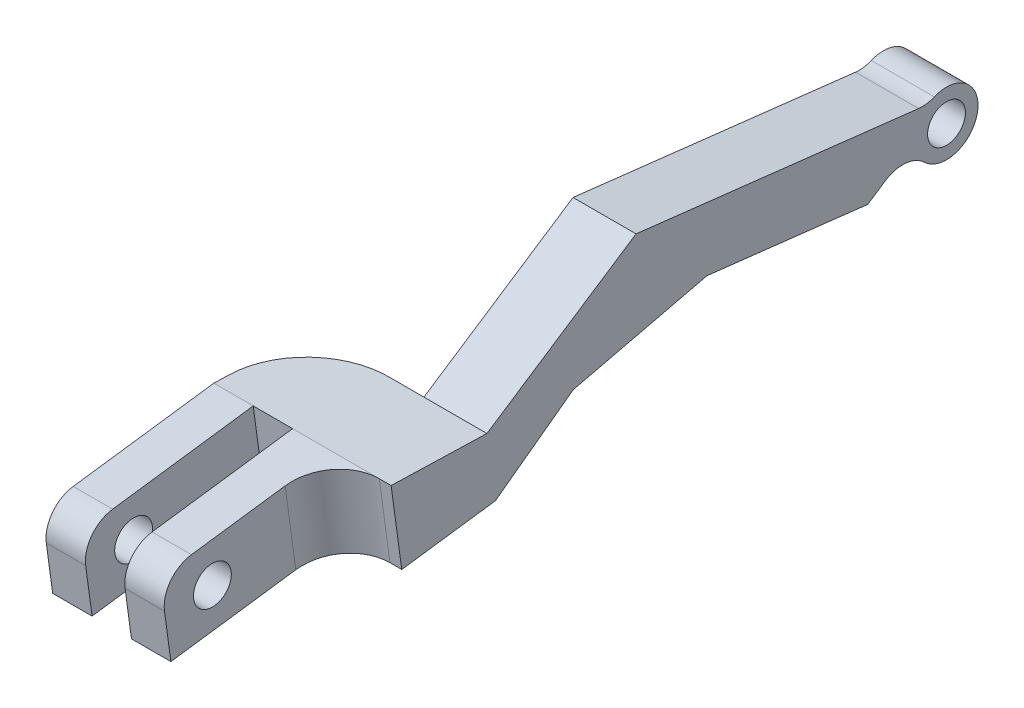
ISO-10303-21;
HEADER;
FILE_DESCRIPTION(('STEP AP214'),'2;1');
FILE_NAME('part.step','',(''),(''),'','','');
FILE_SCHEMA(('AUTOMOTIVE_DESIGN { 1 0 10303 214 1 1 1 1 }'));
ENDSEC;
DATA;
#1=APPLICATION_CONTEXT('core data for automotive mechanical design processes');
#2=APPLICATION_PROTOCOL_DEFINITION('international standard','automotive_design',2000,#1);
#3=PRODUCT_CONTEXT('',#1,'mechanical');
#4=PRODUCT('Part','Part','',(#3));
#5=PRODUCT_RELATED_PRODUCT_CATEGORY('part','',(#4));
#6=PRODUCT_DEFINITION_FORMATION('','',#4);
#7=PRODUCT_DEFINITION_CONTEXT('part definition',#1,'design');
#8=PRODUCT_DEFINITION('design','',#6,#7);
#9=PRODUCT_DEFINITION_SHAPE('','',#8);
#10=(LENGTH_UNIT() NAMED_UNIT(*) SI_UNIT(.MILLI.,.METRE.));
#11=(NAMED_UNIT(*) PLANE_ANGLE_UNIT() SI_UNIT($,.RADIAN.));
#12=(NAMED_UNIT(*) SI_UNIT($,.STERADIAN.) SOLID_ANGLE_UNIT());
#13=UNCERTAINTY_MEASURE_WITH_UNIT(LENGTH_MEASURE(1.E-05),#10,'distance_accuracy_value','');
#14=(GEOMETRIC_REPRESENTATION_CONTEXT(3) GLOBAL_UNCERTAINTY_ASSIGNED_CONTEXT((#13)) GLOBAL_UNIT_ASSIGNED_CONTEXT((#10,
#11,#12)) REPRESENTATION_CONTEXT('',''));
#15=CARTESIAN_POINT('',(0.,0.,0.));
#16=DIRECTION('',(0.,0.,1.));
#17=DIRECTION('',(1.,0.,0.));
#18=AXIS2_PLACEMENT_3D('',#15,#16,#17);
#19=CARTESIAN_POINT('',(-2.,0.,0.));
#20=DIRECTION('',(1.,0.,0.));
#21=DIRECTION('',(0.,0.,-1.));
#22=AXIS2_PLACEMENT_3D('',#19,#20,#21);
#23=PLANE('',#22);
#24=CARTESIAN_POINT('',(-2.,-2.82842712474619,-2.82842712474619));
#25=DIRECTION('',(1.,0.,0.));
#26=DIRECTION('',(0.,0.,-1.));
#27=AXIS2_PLACEMENT_3D('',#24,#25,#26);
#28=CIRCLE('',#27,1.2);
#29=CARTESIAN_POINT('',(-2.,-2.82842712474619,-4.02842712474618));
#30=VERTEX_POINT('',#29);
#31=EDGE_CURVE('E338',#30,#30,#28,.T.);
#32=ORIENTED_EDGE('',*,*,#31,.T.);
#33=EDGE_LOOP('',(#32));
#34=FACE_BOUND('',#33,.T.);
#35=DIRECTION('',(0.,-0.990856207200545,-0.134922113280779));
#36=VECTOR('',#35,1.);
#37=CARTESIAN_POINT('',(-2.,-3.6162780136907,26.5576296553513));
#38=LINE('',#37,#36);
#39=CARTESIAN_POINT('',(-2.,-5.28506014111271,26.3303962691135));
#40=VERTEX_POINT('',#39);
#41=CARTESIAN_POINT('',(-2.,-9.24848496991488,25.7907078159904));
#42=VERTEX_POINT('',#41);
#43=EDGE_CURVE('E273',#40,#42,#38,.T.);
#44=ORIENTED_EDGE('',*,*,#43,.F.);
#45=DIRECTION('',(0.,-0.550374531244968,0.834917885397649));
#46=VECTOR('',#45,1.);
#47=CARTESIAN_POINT('',(-2.,8.41512757073982,5.54721844281332));
#48=LINE('',#47,#46);
#49=CARTESIAN_POINT('',(-2.,0.952983865511061,16.8672866676453));
#50=VERTEX_POINT('',#49);
#51=EDGE_CURVE('E323',#50,#40,#48,.T.);
#52=ORIENTED_EDGE('',*,*,#51,.F.);
#53=DIRECTION('',(0.,0.115063520544876,0.993358135940819));
#54=VECTOR('',#53,1.);
#55=CARTESIAN_POINT('',(-2.,-0.987552066700198,0.114390986900482));
#56=LINE('',#55,#54);
#57=CARTESIAN_POINT('',(-2.,-1.12340755019662,-1.0584668328871));
#58=VERTEX_POINT('',#57);
#59=EDGE_CURVE('E320',#58,#50,#56,.T.);
#60=ORIENTED_EDGE('',*,*,#59,.F.);
#61=CARTESIAN_POINT('',(-2.,0.863308721685015,-1.28859387397686));
#62=DIRECTION('',(1.,0.,0.));
#63=DIRECTION('',(0.,0.,-1.));
#64=AXIS2_PLACEMENT_3D('',#61,#62,#63);
#65=CIRCLE('',#64,2.);
#66=CARTESIAN_POINT('',(-2.,-0.98255920153059,-2.05851049936152));
#67=VERTEX_POINT('',#66);
#68=EDGE_CURVE('E318',#58,#67,#65,.T.);
#69=ORIENTED_EDGE('',*,*,#68,.T.);
#70=CARTESIAN_POINT('',(-2.,-2.82842712474619,-2.82842712474619));
#71=DIRECTION('',(1.,0.,0.));
#72=DIRECTION('',(0.,0.,-1.));
#73=AXIS2_PLACEMENT_3D('',#70,#71,#72);
#74=CIRCLE('',#73,2.);
#75=CARTESIAN_POINT('',(-2.,-4.26750807201749,-1.43952611056239));
#76=VERTEX_POINT('',#75);
#77=EDGE_CURVE('E335',#76,#67,#74,.T.);
#78=ORIENTED_EDGE('',*,*,#77,.F.);
#79=CARTESIAN_POINT('',(-2.,-5.70658901928878,-0.050625096378604));
#80=DIRECTION('',(1.,0.,0.));
#81=DIRECTION('',(0.,0.,-1.));
#82=AXIS2_PLACEMENT_3D('',#79,#80,#81);
#83=CIRCLE('',#82,2.);
#84=CARTESIAN_POINT('',(-2.,-4.03675324849347,1.05012396611132));
#85=VERTEX_POINT('',#84);
#86=EDGE_CURVE('E333',#76,#85,#83,.T.);
#87=ORIENTED_EDGE('',*,*,#86,.T.);
#88=DIRECTION('',(0.,0.550374531244962,-0.834917885397653));
#89=VECTOR('',#88,1.);
#90=CARTESIAN_POINT('',(-2.,-2.33142136393588,-1.53686363982916));
#91=LINE('',#90,#89);
#92=CARTESIAN_POINT('',(-2.,-4.77600788476289,2.17157287525382));
#93=VERTEX_POINT('',#92);
#94=EDGE_CURVE('E330',#93,#85,#91,.T.);
#95=ORIENTED_EDGE('',*,*,#94,.F.);
#96=DIRECTION('',(0.,0.115063520544876,0.993358135940819));
#97=VECTOR('',#96,1.);
#98=CARTESIAN_POINT('',(-2.,-4.96098461046348,0.574645069079988));
#99=LINE('',#98,#97);
#100=CARTESIAN_POINT('',(-2.,-3.59576628097659,12.3607500701208));
#101=VERTEX_POINT('',#100);
#102=EDGE_CURVE('E328',#93,#101,#99,.T.);
#103=ORIENTED_EDGE('',*,*,#102,.T.);
#104=DIRECTION('',(0.,0.231624150850534,-0.972805351929547));
#105=VECTOR('',#104,1.);
#106=CARTESIAN_POINT('',(-2.,-0.617665679203451,-0.147065688085749));
#107=LINE('',#106,#105);
#108=CARTESIAN_POINT('',(-2.,-5.61916698864486,20.8588925578094));
#109=VERTEX_POINT('',#108);
#110=EDGE_CURVE('E11',#101,#109,#107,.F.);
#111=ORIENTED_EDGE('',*,*,#110,.T.);
#112=DIRECTION('',(0.,-0.592706629550145,0.805418432423363));
#113=VECTOR('',#112,1.);
#114=CARTESIAN_POINT('',(-2.,6.31240513743532,4.64529271090441));
#115=LINE('',#114,#113);
#116=EDGE_CURVE('E326',#109,#42,#115,.T.);
#117=ORIENTED_EDGE('',*,*,#116,.T.);
#118=EDGE_LOOP('',(#44,#52,#60,#69,#78,#87,#95,#103,#111,#117));
#119=FACE_BOUND('',#118,.T.);
#120=ADVANCED_FACE('F38',(#34,#119),#23,.F.);
#121=CARTESIAN_POINT('',(-2.,0.863308721685015,-1.28859387397686));
#122=DIRECTION('',(1.,0.,0.));
#123=DIRECTION('',(0.,0.,-1.));
#124=AXIS2_PLACEMENT_3D('',#121,#122,#123);
#125=CYLINDRICAL_SURFACE('',#124,2.);
#126=DIRECTION('',(1.,0.,0.));
#127=VECTOR('',#126,1.);
#128=CARTESIAN_POINT('',(-2.,-1.12340755019662,-1.0584668328871));
#129=LINE('',#128,#127);
#130=CARTESIAN_POINT('',(2.,-1.12340755019662,-1.0584668328871));
#131=VERTEX_POINT('',#130);
#132=EDGE_CURVE('E341',#58,#131,#129,.T.);
#133=ORIENTED_EDGE('',*,*,#132,.T.);
#134=CARTESIAN_POINT('',(2.,0.863308721685015,-1.28859387397686));
#135=DIRECTION('',(1.,0.,0.));
#136=DIRECTION('',(0.,0.,-1.));
#137=AXIS2_PLACEMENT_3D('',#134,#135,#136);
#138=CIRCLE('',#137,2.);
#139=CARTESIAN_POINT('',(2.,-0.98255920153059,-2.05851049936152));
#140=VERTEX_POINT('',#139);
#141=EDGE_CURVE('E284',#131,#140,#138,.T.);
#142=ORIENTED_EDGE('',*,*,#141,.T.);
#143=DIRECTION('',(1.,0.,0.));
#144=VECTOR('',#143,1.);
#145=CARTESIAN_POINT('',(-2.,-0.98255920153059,-2.05851049936152));
#146=LINE('',#145,#144);
#147=EDGE_CURVE('E342',#67,#140,#146,.T.);
#148=ORIENTED_EDGE('',*,*,#147,.F.);
#149=ORIENTED_EDGE('',*,*,#68,.F.);
#150=EDGE_LOOP('',(#133,#142,#148,#149));
#151=FACE_BOUND('',#150,.T.);
#152=ADVANCED_FACE('F438',(#151),#125,.F.);
#153=CARTESIAN_POINT('',(-2.,-2.82842712474619,-2.82842712474619));
#154=DIRECTION('',(1.,0.,0.));
#155=DIRECTION('',(0.,0.,-1.));
#156=AXIS2_PLACEMENT_3D('',#153,#154,#155);
#157=CYLINDRICAL_SURFACE('',#156,2.);
#158=ORIENTED_EDGE('',*,*,#147,.T.);
#159=CARTESIAN_POINT('',(2.,-2.82842712474619,-2.82842712474619));
#160=DIRECTION('',(1.,0.,0.));
#161=DIRECTION('',(0.,0.,-1.));
#162=AXIS2_PLACEMENT_3D('',#159,#160,#161);
#163=CIRCLE('',#162,2.);
#164=CARTESIAN_POINT('',(2.,-4.26750807201749,-1.43952611056239));
#165=VERTEX_POINT('',#164);
#166=EDGE_CURVE('E312',#165,#140,#163,.T.);
#167=ORIENTED_EDGE('',*,*,#166,.F.);
#168=DIRECTION('',(1.,0.,0.));
#169=VECTOR('',#168,1.);
#170=CARTESIAN_POINT('',(-2.,-4.26750807201749,-1.43952611056239));
#171=LINE('',#170,#169);
#172=EDGE_CURVE('E345',#76,#165,#171,.T.);
#173=ORIENTED_EDGE('',*,*,#172,.F.);
#174=ORIENTED_EDGE('',*,*,#77,.T.);
#175=EDGE_LOOP('',(#158,#167,#173,#174));
#176=FACE_BOUND('',#175,.T.);
#177=ADVANCED_FACE('F445',(#176),#157,.T.);
#178=CARTESIAN_POINT('',(-2.,-5.70658901928878,-0.050625096378604));
#179=DIRECTION('',(1.,0.,0.));
#180=DIRECTION('',(0.,0.,-1.));
#181=AXIS2_PLACEMENT_3D('',#178,#179,#180);
#182=CYLINDRICAL_SURFACE('',#181,2.);
#183=ORIENTED_EDGE('',*,*,#172,.T.);
#184=CARTESIAN_POINT('',(2.,-5.70658901928878,-0.050625096378604));
#185=DIRECTION('',(1.,0.,0.));
#186=DIRECTION('',(0.,0.,-1.));
#187=AXIS2_PLACEMENT_3D('',#184,#185,#186);
#188=CIRCLE('',#187,2.);
#189=CARTESIAN_POINT('',(2.,-4.03675324849347,1.05012396611132));
#190=VERTEX_POINT('',#189);
#191=EDGE_CURVE('E309',#165,#190,#188,.T.);
#192=ORIENTED_EDGE('',*,*,#191,.T.);
#193=DIRECTION('',(1.,0.,0.));
#194=VECTOR('',#193,1.);
#195=CARTESIAN_POINT('',(-2.,-4.03675324849347,1.05012396611132));
#196=LINE('',#195,#194);
#197=EDGE_CURVE('E347',#85,#190,#196,.T.);
#198=ORIENTED_EDGE('',*,*,#197,.F.);
#199=ORIENTED_EDGE('',*,*,#86,.F.);
#200=EDGE_LOOP('',(#183,#192,#198,#199));
#201=FACE_BOUND('',#200,.T.);
#202=ADVANCED_FACE('F447',(#201),#182,.F.);
#203=CARTESIAN_POINT('',(-2.,-2.33142136393588,-1.53686363982916));
#204=DIRECTION('',(0.,-0.834917885397653,-0.550374531244962));
#205=DIRECTION('',(0.,0.550374531244962,-0.834917885397653));
#206=AXIS2_PLACEMENT_3D('',#203,#204,#205);
#207=PLANE('',#206);
#208=ORIENTED_EDGE('',*,*,#197,.T.);
#209=DIRECTION('',(0.,0.550374531244962,-0.834917885397653));
#210=VECTOR('',#209,1.);
#211=CARTESIAN_POINT('',(2.,-2.33142136393588,-1.53686363982916));
#212=LINE('',#211,#210);
#213=CARTESIAN_POINT('',(2.,-4.77600788476289,2.17157287525382));
#214=VERTEX_POINT('',#213);
#215=EDGE_CURVE('E306',#214,#190,#212,.T.);
#216=ORIENTED_EDGE('',*,*,#215,.F.);
#217=DIRECTION('',(1.,0.,0.));
#218=VECTOR('',#217,1.);
#219=CARTESIAN_POINT('',(-2.,-4.77600788476289,2.17157287525382));
#220=LINE('',#219,#218);
#221=EDGE_CURVE('E349',#93,#214,#220,.T.);
#222=ORIENTED_EDGE('',*,*,#221,.F.);
#223=ORIENTED_EDGE('',*,*,#94,.T.);
#224=EDGE_LOOP('',(#208,#216,#222,#223));
#225=FACE_BOUND('',#224,.T.);
#226=ADVANCED_FACE('F450',(#225),#207,.T.);
#227=CARTESIAN_POINT('',(-2.,-4.96098461046348,0.574645069079988));
#228=DIRECTION('',(0.,0.993358135940819,-0.115063520544876));
#229=DIRECTION('',(0.,0.115063520544876,0.993358135940819));
#230=AXIS2_PLACEMENT_3D('',#227,#228,#229);
#231=PLANE('',#230);
#232=DIRECTION('',(0.,0.115063520544876,0.993358135940819));
#233=VECTOR('',#232,1.);
#234=CARTESIAN_POINT('',(2.,-4.96098461046348,0.574645069079988));
#235=LINE('',#234,#233);
#236=CARTESIAN_POINT('',(2.,-3.59576628097659,12.3607500701208));
#237=VERTEX_POINT('',#236);
#238=EDGE_CURVE('E304',#214,#237,#235,.T.);
#239=ORIENTED_EDGE('',*,*,#238,.T.);
#240=DIRECTION('',(-1.,0.,0.));
#241=VECTOR('',#240,1.);
#242=CARTESIAN_POINT('',(-2.,-3.59576628097659,12.3607500701208));
#243=LINE('',#242,#241);
#244=EDGE_CURVE('E54',#237,#101,#243,.T.);
#245=ORIENTED_EDGE('',*,*,#244,.T.);
#246=ORIENTED_EDGE('',*,*,#102,.F.);
#247=ORIENTED_EDGE('',*,*,#221,.T.);
#248=EDGE_LOOP('',(#239,#245,#246,#247));
#249=FACE_BOUND('',#248,.T.);
#250=ADVANCED_FACE('F478',(#249),#231,.F.);
#251=CARTESIAN_POINT('',(-2.,6.31240513743532,4.64529271090441));
#252=DIRECTION('',(0.,0.805418432423363,0.592706629550145));
#253=DIRECTION('',(0.,-0.592706629550145,0.805418432423363));
#254=AXIS2_PLACEMENT_3D('',#251,#252,#253);
#255=PLANE('',#254);
#256=ORIENTED_EDGE('',*,*,#116,.F.);
#257=DIRECTION('',(1.,0.,0.));
#258=VECTOR('',#257,1.);
#259=CARTESIAN_POINT('',(2.,-5.61916698864485,20.8588925578094));
#260=LINE('',#259,#258);
#261=CARTESIAN_POINT('',(2.,-5.61916698864486,20.8588925578094));
#262=VERTEX_POINT('',#261);
#263=EDGE_CURVE('E397',#109,#262,#260,.T.);
#264=ORIENTED_EDGE('',*,*,#263,.T.);
#265=DIRECTION('',(0.,-0.592706629550145,0.805418432423363));
#266=VECTOR('',#265,1.);
#267=CARTESIAN_POINT('',(2.,6.31240513743532,4.64529271090441));
#268=LINE('',#267,#266);
#269=CARTESIAN_POINT('',(2.,-9.24848496991488,25.7907078159904));
#270=VERTEX_POINT('',#269);
#271=EDGE_CURVE('E302',#262,#270,#268,.T.);
#272=ORIENTED_EDGE('',*,*,#271,.T.);
#273=DIRECTION('',(1.,0.,0.));
#274=VECTOR('',#273,1.);
#275=CARTESIAN_POINT('',(-2.,-9.24848496991488,25.7907078159904));
#276=LINE('',#275,#274);
#277=EDGE_CURVE('E351',#42,#270,#276,.T.);
#278=ORIENTED_EDGE('',*,*,#277,.F.);
#279=EDGE_LOOP('',(#256,#264,#272,#278));
#280=FACE_BOUND('',#279,.T.);
#281=ADVANCED_FACE('F403',(#280),#255,.F.);
#282=CARTESIAN_POINT('',(-2.,-5.63220695622419,-0.766921839360962));
#283=DIRECTION('',(0.,0.990856207200545,0.134922113280778));
#284=DIRECTION('',(0.,-0.134922113280778,0.990856207200545));
#285=AXIS2_PLACEMENT_3D('',#282,#283,#284);
#286=PLANE('',#285);
#287=DIRECTION('',(0.,0.134922113280778,-0.990856207200545));
#288=VECTOR('',#287,1.);
#289=CARTESIAN_POINT('',(-9.25,-5.6322069562242,-0.766921839360962));
#290=LINE('',#289,#288);
#291=CARTESIAN_POINT('',(-9.25,-11.5421608956881,42.6352633383996));
#292=VERTEX_POINT('',#291);
#293=CARTESIAN_POINT('',(-9.25,-9.92309553631877,30.7449888519931));
#294=VERTEX_POINT('',#293);
#295=EDGE_CURVE('E209',#292,#294,#290,.T.);
#296=ORIENTED_EDGE('',*,*,#295,.T.);
#297=CARTESIAN_POINT('',(-4.25,-9.92309553631877,30.7449888519931));
#298=DIRECTION('',(0.,0.990856207200545,0.134922113280778));
#299=DIRECTION('',(0.,-0.134922113280778,0.990856207200545));
#300=AXIS2_PLACEMENT_3D('',#297,#298,#299);
#301=CIRCLE('',#300,5.);
#302=CARTESIAN_POINT('',(-4.25,-9.24848496991488,25.7907078159904));
#303=VERTEX_POINT('',#302);
#304=EDGE_CURVE('E391',#294,#303,#301,.F.);
#305=ORIENTED_EDGE('',*,*,#304,.T.);
#306=DIRECTION('',(1.,0.,0.));
#307=VECTOR('',#306,1.);
#308=CARTESIAN_POINT('',(-4.25,-9.24848496991488,25.7907078159904));
#309=LINE('',#308,#307);
#310=EDGE_CURVE('E277',#303,#42,#309,.T.);
#311=ORIENTED_EDGE('',*,*,#310,.T.);
#312=ORIENTED_EDGE('',*,*,#277,.T.);
#313=DIRECTION('',(0.,-0.134922113280778,0.990856207200545));
#314=VECTOR('',#313,1.);
#315=CARTESIAN_POINT('',(2.,-5.63220695622419,-0.766921839360962));
#316=LINE('',#315,#314);
#317=CARTESIAN_POINT('',(2.,-10.0580176495996,31.7358450591936));
#318=VERTEX_POINT('',#317);
#319=EDGE_CURVE('E299',#270,#318,#316,.T.);
#320=ORIENTED_EDGE('',*,*,#319,.T.);
#321=DIRECTION('',(1.,0.,0.));
#322=VECTOR('',#321,1.);
#323=CARTESIAN_POINT('',(-2.,-10.0580176495996,31.7358450591936));
#324=LINE('',#323,#322);
#325=CARTESIAN_POINT('',(1.25,-10.0580176495996,31.7358450591936));
#326=VERTEX_POINT('',#325);
#327=EDGE_CURVE('E354',#326,#318,#324,.T.);
#328=ORIENTED_EDGE('',*,*,#327,.F.);
#329=CARTESIAN_POINT('',(1.25,-10.4627839894419,34.7084136807953));
#330=DIRECTION('',(0.,0.990856207200545,0.134922113280778));
#331=DIRECTION('',(0.,-0.134922113280778,0.990856207200545));
#332=AXIS2_PLACEMENT_3D('',#329,#330,#331);
#333=CIRCLE('',#332,3.);
#334=CARTESIAN_POINT('',(-1.75,-10.4627839894419,34.7084136807953));
#335=VERTEX_POINT('',#334);
#336=EDGE_CURVE('E371',#326,#335,#333,.T.);
#337=ORIENTED_EDGE('',*,*,#336,.T.);
#338=DIRECTION('',(0.,-0.134922113280778,0.990856207200545));
#339=VECTOR('',#338,1.);
#340=CARTESIAN_POINT('',(-1.75,-5.63220695622419,-0.766921839360962));
#341=LINE('',#340,#339);
#342=CARTESIAN_POINT('',(-1.75,-11.5421608956881,42.6352633383996));
#343=VERTEX_POINT('',#342);
#344=EDGE_CURVE('E258',#335,#343,#341,.T.);
#345=ORIENTED_EDGE('',*,*,#344,.T.);
#346=DIRECTION('',(-1.,0.,0.));
#347=VECTOR('',#346,1.);
#348=CARTESIAN_POINT('',(-1.75,-11.5421608956881,42.6352633383996));
#349=LINE('',#348,#347);
#350=CARTESIAN_POINT('',(-4.25,-11.5421608956881,42.6352633383996));
#351=VERTEX_POINT('',#350);
#352=EDGE_CURVE('E267',#343,#351,#349,.T.);
#353=ORIENTED_EDGE('',*,*,#352,.T.);
#354=DIRECTION('',(0.,-0.134922113280778,0.990856207200545));
#355=VECTOR('',#354,1.);
#356=CARTESIAN_POINT('',(-4.25,-5.63220695622419,-0.766921839360962));
#357=LINE('',#356,#355);
#358=CARTESIAN_POINT('',(-4.25,-10.0580176495995,31.7358450591936));
#359=VERTEX_POINT('',#358);
#360=EDGE_CURVE('E274',#359,#351,#357,.T.);
#361=ORIENTED_EDGE('',*,*,#360,.F.);
#362=DIRECTION('',(1.,0.,0.));
#363=VECTOR('',#362,1.);
#364=CARTESIAN_POINT('',(-6.75,-10.0580176495995,31.7358450591936));
#365=LINE('',#364,#363);
#366=CARTESIAN_POINT('',(-6.75,-10.0580176495995,31.7358450591936));
#367=VERTEX_POINT('',#366);
#368=EDGE_CURVE('E249',#367,#359,#365,.T.);
#369=ORIENTED_EDGE('',*,*,#368,.F.);
#370=DIRECTION('',(0.,0.134922113280778,-0.990856207200545));
#371=VECTOR('',#370,1.);
#372=CARTESIAN_POINT('',(-6.75,-5.6322069562242,-0.766921839360962));
#373=LINE('',#372,#371);
#374=CARTESIAN_POINT('',(-6.75,-11.5421608956881,42.6352633383996));
#375=VERTEX_POINT('',#374);
#376=EDGE_CURVE('E215',#375,#367,#373,.T.);
#377=ORIENTED_EDGE('',*,*,#376,.F.);
#378=DIRECTION('',(1.,0.,0.));
#379=VECTOR('',#378,1.);
#380=CARTESIAN_POINT('',(-9.25,-11.5421608956881,42.6352633383996));
#381=LINE('',#380,#379);
#382=EDGE_CURVE('E201',#292,#375,#381,.T.);
#383=ORIENTED_EDGE('',*,*,#382,.F.);
#384=EDGE_LOOP('',(#296,#305,#311,#312,#320,#328,#337,#345,#353,#361,#369,#377,#383));
#385=FACE_BOUND('',#384,.T.);
#386=ADVANCED_FACE('F213',(#385),#286,.F.);
#387=CARTESIAN_POINT('',(-2.,-4.4258106933754,32.5027668985546));
#388=DIRECTION('',(0.,-0.13492211328078,0.990856207200544));
#389=DIRECTION('',(0.,-0.990856207200545,-0.13492211328078));
#390=AXIS2_PLACEMENT_3D('',#387,#388,#389);
#391=PLANE('',#390);
#392=DIRECTION('',(1.,0.,0.));
#393=VECTOR('',#392,1.);
#394=CARTESIAN_POINT('',(-2.,-5.10373661359682,32.4104556255975));
#395=LINE('',#394,#393);
#396=CARTESIAN_POINT('',(1.25,-5.10373661359682,32.4104556255975));
#397=VERTEX_POINT('',#396);
#398=CARTESIAN_POINT('',(2.,-5.10373661359682,32.4104556255975));
#399=VERTEX_POINT('',#398);
#400=EDGE_CURVE('E358',#397,#399,#395,.T.);
#401=ORIENTED_EDGE('',*,*,#400,.F.);
#402=DIRECTION('',(0.,0.990856207200545,0.13492211328078));
#403=VECTOR('',#402,1.);
#404=CARTESIAN_POINT('',(1.25,-10.0580176495996,31.7358450591936));
#405=LINE('',#404,#403);
#406=EDGE_CURVE('E366',#397,#326,#405,.F.);
#407=ORIENTED_EDGE('',*,*,#406,.T.);
#408=ORIENTED_EDGE('',*,*,#327,.T.);
#409=DIRECTION('',(0.,-0.990856207200545,-0.13492211328078));
#410=VECTOR('',#409,1.);
#411=CARTESIAN_POINT('',(2.,-4.4258106933754,32.5027668985546));
#412=LINE('',#411,#410);
#413=EDGE_CURVE('E296',#399,#318,#412,.T.);
#414=ORIENTED_EDGE('',*,*,#413,.F.);
#415=EDGE_LOOP('',(#401,#407,#408,#414));
#416=FACE_BOUND('',#415,.T.);
#417=ADVANCED_FACE('F485',(#416),#391,.T.);
#418=CARTESIAN_POINT('',(-2.,-6.06490845541675,0.180871687383165));
#419=DIRECTION('',(0.,-0.99955560096244,0.0298094042982462));
#420=DIRECTION('',(0.,-0.0298094042982462,-0.99955560096244));
#421=AXIS2_PLACEMENT_3D('',#418,#419,#420);
#422=PLANE('',#421);
#423=DIRECTION('',(1.,0.,0.));
#424=VECTOR('',#423,1.);
#425=CARTESIAN_POINT('',(-4.25,-5.2850601411127,26.3303962691135));
#426=LINE('',#425,#424);
#427=CARTESIAN_POINT('',(-4.25,-5.2850601411127,26.3303962691135));
#428=VERTEX_POINT('',#427);
#429=EDGE_CURVE('E282',#428,#40,#426,.T.);
#430=ORIENTED_EDGE('',*,*,#429,.F.);
#431=CARTESIAN_POINT('',(-4.25,-5.13395720151614,31.3971123995169));
#432=DIRECTION('',(0.,-0.99955560096244,0.0298094042982462));
#433=DIRECTION('',(0.,-0.0298094042982462,-0.99955560096244));
#434=AXIS2_PLACEMENT_3D('',#431,#432,#433);
#435=ELLIPSE('',#434,5.06896877524852,5.);
#436=CARTESIAN_POINT('',(-9.25,-5.13395720151613,31.3971123995169));
#437=VERTEX_POINT('',#436);
#438=EDGE_CURVE('E395',#428,#437,#435,.F.);
#439=ORIENTED_EDGE('',*,*,#438,.T.);
#440=DIRECTION('',(0.,-0.0298094042982462,-0.99955560096244));
#441=VECTOR('',#440,1.);
#442=CARTESIAN_POINT('',(-9.25,-6.06490845541675,0.180871687383165));
#443=LINE('',#442,#441);
#444=CARTESIAN_POINT('',(-9.25,-5.10373661359682,32.4104556255976));
#445=VERTEX_POINT('',#444);
#446=EDGE_CURVE('E235',#445,#437,#443,.T.);
#447=ORIENTED_EDGE('',*,*,#446,.F.);
#448=DIRECTION('',(1.,0.,0.));
#449=VECTOR('',#448,1.);
#450=CARTESIAN_POINT('',(-9.25,-5.10373661359682,32.4104556255976));
#451=LINE('',#450,#449);
#452=CARTESIAN_POINT('',(-6.75,-5.10373661359682,32.4104556255976));
#453=VERTEX_POINT('',#452);
#454=EDGE_CURVE('E217',#445,#453,#451,.T.);
#455=ORIENTED_EDGE('',*,*,#454,.T.);
#456=DIRECTION('',(1.,0.,0.));
#457=VECTOR('',#456,1.);
#458=CARTESIAN_POINT('',(-6.75,-5.10373661359682,32.4104556255975));
#459=LINE('',#458,#457);
#460=CARTESIAN_POINT('',(-4.25,-5.10373661359682,32.4104556255975));
#461=VERTEX_POINT('',#460);
#462=EDGE_CURVE('E245',#453,#461,#459,.T.);
#463=ORIENTED_EDGE('',*,*,#462,.T.);
#464=EDGE_CURVE('E356',#461,#397,#395,.T.);
#465=ORIENTED_EDGE('',*,*,#464,.T.);
#466=ORIENTED_EDGE('',*,*,#400,.T.);
#467=DIRECTION('',(0.,-0.0298094042982462,-0.99955560096244));
#468=VECTOR('',#467,1.);
#469=CARTESIAN_POINT('',(2.,-6.06490845541675,0.180871687383165));
#470=LINE('',#469,#468);
#471=CARTESIAN_POINT('',(2.,-5.28506014111271,26.3303962691135));
#472=VERTEX_POINT('',#471);
#473=EDGE_CURVE('E293',#399,#472,#470,.T.);
#474=ORIENTED_EDGE('',*,*,#473,.T.);
#475=DIRECTION('',(1.,0.,0.));
#476=VECTOR('',#475,1.);
#477=CARTESIAN_POINT('',(-2.,-5.28506014111271,26.3303962691135));
#478=LINE('',#477,#476);
#479=EDGE_CURVE('E359',#40,#472,#478,.T.);
#480=ORIENTED_EDGE('',*,*,#479,.F.);
#481=EDGE_LOOP('',(#430,#439,#447,#455,#463,#465,#466,#474,#480));
#482=FACE_BOUND('',#481,.T.);
#483=ADVANCED_FACE('F426',(#482),#422,.F.);
#484=CARTESIAN_POINT('',(-2.,8.41512757073982,5.54721844281332));
#485=DIRECTION('',(0.,0.834917885397649,0.550374531244968));
#486=DIRECTION('',(0.,-0.550374531244968,0.834917885397649));
#487=AXIS2_PLACEMENT_3D('',#484,#485,#486);
#488=PLANE('',#487);
#489=ORIENTED_EDGE('',*,*,#479,.T.);
#490=DIRECTION('',(0.,-0.550374531244968,0.834917885397649));
#491=VECTOR('',#490,1.);
#492=CARTESIAN_POINT('',(2.,8.41512757073982,5.54721844281332));
#493=LINE('',#492,#491);
#494=CARTESIAN_POINT('',(2.,0.952983865511061,16.8672866676453));
#495=VERTEX_POINT('',#494);
#496=EDGE_CURVE('E290',#495,#472,#493,.T.);
#497=ORIENTED_EDGE('',*,*,#496,.F.);
#498=DIRECTION('',(1.,0.,0.));
#499=VECTOR('',#498,1.);
#500=CARTESIAN_POINT('',(-2.,0.952983865511061,16.8672866676453));
#501=LINE('',#500,#499);
#502=EDGE_CURVE('E361',#50,#495,#501,.T.);
#503=ORIENTED_EDGE('',*,*,#502,.F.);
#504=ORIENTED_EDGE('',*,*,#51,.T.);
#505=EDGE_LOOP('',(#489,#497,#503,#504));
#506=FACE_BOUND('',#505,.T.);
#507=ADVANCED_FACE('F430',(#506),#488,.T.);
#508=CARTESIAN_POINT('',(-2.,-0.987552066700198,0.114390986900482));
#509=DIRECTION('',(0.,0.993358135940819,-0.115063520544876));
#510=DIRECTION('',(0.,0.115063520544876,0.993358135940819));
#511=AXIS2_PLACEMENT_3D('',#508,#509,#510);
#512=PLANE('',#511);
#513=ORIENTED_EDGE('',*,*,#502,.T.);
#514=DIRECTION('',(0.,0.115063520544876,0.993358135940819));
#515=VECTOR('',#514,1.);
#516=CARTESIAN_POINT('',(2.,-0.987552066700198,0.114390986900482));
#517=LINE('',#516,#515);
#518=EDGE_CURVE('E287',#131,#495,#517,.T.);
#519=ORIENTED_EDGE('',*,*,#518,.F.);
#520=ORIENTED_EDGE('',*,*,#132,.F.);
#521=ORIENTED_EDGE('',*,*,#59,.T.);
#522=EDGE_LOOP('',(#513,#519,#520,#521));
#523=FACE_BOUND('',#522,.T.);
#524=ADVANCED_FACE('F433',(#523),#512,.T.);
#525=CARTESIAN_POINT('',(-2.,-2.82842712474619,-2.82842712474619));
#526=DIRECTION('',(1.,0.,0.));
#527=DIRECTION('',(0.,0.,-1.));
#528=AXIS2_PLACEMENT_3D('',#525,#526,#527);
#529=CYLINDRICAL_SURFACE('',#528,1.2);
#530=ORIENTED_EDGE('',*,*,#31,.F.);
#531=EDGE_LOOP('',(#530));
#532=FACE_BOUND('',#531,.T.);
#533=CARTESIAN_POINT('',(2.,-2.82842712474619,-2.82842712474619));
#534=DIRECTION('',(1.,0.,0.));
#535=DIRECTION('',(0.,0.,-1.));
#536=AXIS2_PLACEMENT_3D('',#533,#534,#535);
#537=CIRCLE('',#536,1.2);
#538=CARTESIAN_POINT('',(2.,-2.82842712474619,-4.02842712474618));
#539=VERTEX_POINT('',#538);
#540=EDGE_CURVE('E315',#539,#539,#537,.T.);
#541=ORIENTED_EDGE('',*,*,#540,.T.);
#542=EDGE_LOOP('',(#541));
#543=FACE_BOUND('',#542,.T.);
#544=ADVANCED_FACE('F468',(#532,#543),#529,.F.);
#545=CARTESIAN_POINT('',(2.,0.,0.));
#546=DIRECTION('',(1.,0.,0.));
#547=DIRECTION('',(0.,0.,-1.));
#548=AXIS2_PLACEMENT_3D('',#545,#546,#547);
#549=PLANE('',#548);
#550=ORIENTED_EDGE('',*,*,#141,.F.);
#551=ORIENTED_EDGE('',*,*,#518,.T.);
#552=ORIENTED_EDGE('',*,*,#496,.T.);
#553=ORIENTED_EDGE('',*,*,#473,.F.);
#554=ORIENTED_EDGE('',*,*,#413,.T.);
#555=ORIENTED_EDGE('',*,*,#319,.F.);
#556=ORIENTED_EDGE('',*,*,#271,.F.);
#557=DIRECTION('',(0.,-0.231624150850534,0.972805351929547));
#558=VECTOR('',#557,1.);
#559=CARTESIAN_POINT('',(2.,-5.61916698864485,20.8588925578094));
#560=LINE('',#559,#558);
#561=EDGE_CURVE('E47',#262,#237,#560,.F.);
#562=ORIENTED_EDGE('',*,*,#561,.T.);
#563=ORIENTED_EDGE('',*,*,#238,.F.);
#564=ORIENTED_EDGE('',*,*,#215,.T.);
#565=ORIENTED_EDGE('',*,*,#191,.F.);
#566=ORIENTED_EDGE('',*,*,#166,.T.);
#567=EDGE_LOOP('',(#550,#551,#552,#553,#554,#555,#556,#562,#563,#564,#565,#566));
#568=FACE_BOUND('',#567,.T.);
#569=ORIENTED_EDGE('',*,*,#540,.F.);
#570=EDGE_LOOP('',(#569));
#571=FACE_BOUND('',#570,.T.);
#572=ADVANCED_FACE('F409',(#568,#571),#549,.T.);
#573=CARTESIAN_POINT('',(-4.25,-3.6162780136907,26.5576296553513));
#574=DIRECTION('',(0.,-0.134922113280779,0.990856207200545));
#575=DIRECTION('',(0.,-0.990856207200545,-0.134922113280779));
#576=AXIS2_PLACEMENT_3D('',#573,#574,#575);
#577=PLANE('',#576);
#578=ORIENTED_EDGE('',*,*,#310,.F.);
#579=DIRECTION('',(0.,-0.990856207200545,-0.134922113280779));
#580=VECTOR('',#579,1.);
#581=CARTESIAN_POINT('',(-4.25,-3.6162780136907,26.5576296553513));
#582=LINE('',#581,#580);
#583=EDGE_CURVE('E393',#303,#428,#582,.F.);
#584=ORIENTED_EDGE('',*,*,#583,.T.);
#585=ORIENTED_EDGE('',*,*,#429,.T.);
#586=ORIENTED_EDGE('',*,*,#43,.T.);
#587=EDGE_LOOP('',(#578,#584,#585,#586));
#588=FACE_BOUND('',#587,.T.);
#589=ADVANCED_FACE('F418',(#588),#577,.F.);
#590=CARTESIAN_POINT('',(-4.25,0.,0.));
#591=DIRECTION('',(1.,0.,0.));
#592=DIRECTION('',(0.,0.,-1.));
#593=AXIS2_PLACEMENT_3D('',#590,#591,#592);
#594=PLANE('',#593);
#595=DIRECTION('',(0.,-0.990856207200545,-0.134922113280776));
#596=VECTOR('',#595,1.);
#597=CARTESIAN_POINT('',(-4.25,-5.90995393946383,43.4021851777606));
#598=LINE('',#597,#596);
#599=CARTESIAN_POINT('',(-4.25,-8.56959227408647,43.040029678242));
#600=VERTEX_POINT('',#599);
#601=EDGE_CURVE('E255',#600,#351,#598,.T.);
#602=ORIENTED_EDGE('',*,*,#601,.F.);
#603=CARTESIAN_POINT('',(-4.25,-8.29974804752492,41.0583172638409));
#604=DIRECTION('',(1.,0.,0.));
#605=DIRECTION('',(0.,0.,-1.));
#606=AXIS2_PLACEMENT_3D('',#603,#604,#605);
#607=CIRCLE('',#606,2.);
#608=CARTESIAN_POINT('',(-4.25,-6.31803563312383,41.3281614904025));
#609=VERTEX_POINT('',#608);
#610=EDGE_CURVE('E376',#600,#609,#607,.F.);
#611=ORIENTED_EDGE('',*,*,#610,.T.);
#612=DIRECTION('',(0.,-0.134922113280779,0.990856207200545));
#613=VECTOR('',#612,1.);
#614=CARTESIAN_POINT('',(-4.25,-0.677925920221461,-0.0923112729570694));
#615=LINE('',#614,#613);
#616=EDGE_CURVE('E262',#461,#609,#615,.T.);
#617=ORIENTED_EDGE('',*,*,#616,.F.);
#618=DIRECTION('',(0.,-0.990856207200545,-0.13492211328078));
#619=VECTOR('',#618,1.);
#620=CARTESIAN_POINT('',(-4.25,-4.4258106933754,32.5027668985546));
#621=LINE('',#620,#619);
#622=EDGE_CURVE('E216',#461,#359,#621,.T.);
#623=ORIENTED_EDGE('',*,*,#622,.T.);
#624=ORIENTED_EDGE('',*,*,#360,.T.);
#625=EDGE_LOOP('',(#602,#611,#617,#623,#624));
#626=FACE_BOUND('',#625,.T.);
#627=CARTESIAN_POINT('',(-4.25,-8.66025403784442,40.));
#628=DIRECTION('',(1.,0.,0.));
#629=DIRECTION('',(0.,0.,-1.));
#630=AXIS2_PLACEMENT_3D('',#627,#628,#629);
#631=CIRCLE('',#630,1.2);
#632=CARTESIAN_POINT('',(-4.25,-8.66025403784442,38.8));
#633=VERTEX_POINT('',#632);
#634=EDGE_CURVE('E251',#633,#633,#631,.T.);
#635=ORIENTED_EDGE('',*,*,#634,.T.);
#636=EDGE_LOOP('',(#635));
#637=FACE_BOUND('',#636,.T.);
#638=ADVANCED_FACE('F529',(#626,#637),#594,.F.);
#639=CARTESIAN_POINT('',(-1.75,0.,0.));
#640=DIRECTION('',(1.,0.,0.));
#641=DIRECTION('',(0.,0.,-1.));
#642=AXIS2_PLACEMENT_3D('',#639,#640,#641);
#643=PLANE('',#642);
#644=DIRECTION('',(0.,-0.134922113280779,0.990856207200545));
#645=VECTOR('',#644,1.);
#646=CARTESIAN_POINT('',(-1.75,-0.677925920221461,-0.0923112729570694));
#647=LINE('',#646,#645);
#648=CARTESIAN_POINT('',(-1.75,-5.50850295343916,35.3830242471992));
#649=VERTEX_POINT('',#648);
#650=CARTESIAN_POINT('',(-1.75,-6.31803563312383,41.3281614904025));
#651=VERTEX_POINT('',#650);
#652=EDGE_CURVE('E264',#649,#651,#647,.T.);
#653=ORIENTED_EDGE('',*,*,#652,.T.);
#654=CARTESIAN_POINT('',(-1.75,-8.29974804752492,41.0583172638409));
#655=DIRECTION('',(1.,0.,0.));
#656=DIRECTION('',(0.,0.,-1.));
#657=AXIS2_PLACEMENT_3D('',#654,#655,#656);
#658=CIRCLE('',#657,2.);
#659=CARTESIAN_POINT('',(-1.75,-8.56959227408647,43.040029678242));
#660=VERTEX_POINT('',#659);
#661=EDGE_CURVE('E380',#651,#660,#658,.T.);
#662=ORIENTED_EDGE('',*,*,#661,.T.);
#663=DIRECTION('',(0.,-0.990856207200545,-0.134922113280776));
#664=VECTOR('',#663,1.);
#665=CARTESIAN_POINT('',(-1.75,-5.90995393946383,43.4021851777606));
#666=LINE('',#665,#664);
#667=EDGE_CURVE('E261',#660,#343,#666,.T.);
#668=ORIENTED_EDGE('',*,*,#667,.T.);
#669=ORIENTED_EDGE('',*,*,#344,.F.);
#670=DIRECTION('',(0.,0.990856207200545,0.13492211328078));
#671=VECTOR('',#670,1.);
#672=CARTESIAN_POINT('',(-1.75,-5.50850295343916,35.3830242471992));
#673=LINE('',#672,#671);
#674=EDGE_CURVE('E344',#335,#649,#673,.T.);
#675=ORIENTED_EDGE('',*,*,#674,.T.);
#676=EDGE_LOOP('',(#653,#662,#668,#669,#675));
#677=FACE_BOUND('',#676,.T.);
#678=CARTESIAN_POINT('',(-1.75,-8.66025403784442,40.));
#679=DIRECTION('',(1.,0.,0.));
#680=DIRECTION('',(0.,0.,-1.));
#681=AXIS2_PLACEMENT_3D('',#678,#679,#680);
#682=CIRCLE('',#681,1.2);
#683=CARTESIAN_POINT('',(-1.75,-8.66025403784442,38.8));
#684=VERTEX_POINT('',#683);
#685=EDGE_CURVE('E252',#684,#684,#682,.T.);
#686=ORIENTED_EDGE('',*,*,#685,.F.);
#687=EDGE_LOOP('',(#686));
#688=FACE_BOUND('',#687,.T.);
#689=ADVANCED_FACE('F539',(#677,#688),#643,.T.);
#690=CARTESIAN_POINT('',(-1.75,-0.677925920221461,-0.0923112729570694));
#691=DIRECTION('',(0.,-0.990856207200545,-0.134922113280779));
#692=DIRECTION('',(0.,0.134922113280779,-0.990856207200545));
#693=AXIS2_PLACEMENT_3D('',#690,#691,#692);
#694=PLANE('',#693);
#695=ORIENTED_EDGE('',*,*,#616,.T.);
#696=DIRECTION('',(-1.,0.,0.));
#697=VECTOR('',#696,1.);
#698=CARTESIAN_POINT('',(-1.75,-6.31803563312383,41.3281614904025));
#699=LINE('',#698,#697);
#700=EDGE_CURVE('E378',#609,#651,#699,.F.);
#701=ORIENTED_EDGE('',*,*,#700,.T.);
#702=ORIENTED_EDGE('',*,*,#652,.F.);
#703=CARTESIAN_POINT('',(1.25,-5.50850295343916,35.3830242471992));
#704=DIRECTION('',(0.,-0.990856207200545,-0.134922113280779));
#705=DIRECTION('',(0.,0.134922113280779,-0.990856207200545));
#706=AXIS2_PLACEMENT_3D('',#703,#704,#705);
#707=CIRCLE('',#706,3.);
#708=EDGE_CURVE('E368',#649,#397,#707,.T.);
#709=ORIENTED_EDGE('',*,*,#708,.T.);
#710=ORIENTED_EDGE('',*,*,#464,.F.);
#711=EDGE_LOOP('',(#695,#701,#702,#709,#710));
#712=FACE_BOUND('',#711,.T.);
#713=ADVANCED_FACE('F524',(#712),#694,.F.);
#714=CARTESIAN_POINT('',(-1.75,-5.90995393946383,43.4021851777606));
#715=DIRECTION('',(0.,0.134922113280776,-0.990856207200545));
#716=DIRECTION('',(0.,0.990856207200545,0.134922113280776));
#717=AXIS2_PLACEMENT_3D('',#714,#715,#716);
#718=PLANE('',#717);
#719=ORIENTED_EDGE('',*,*,#667,.F.);
#720=DIRECTION('',(-1.,0.,0.));
#721=VECTOR('',#720,1.);
#722=CARTESIAN_POINT('',(-1.75,-8.56959227408647,43.040029678242));
#723=LINE('',#722,#721);
#724=EDGE_CURVE('E373',#660,#600,#723,.T.);
#725=ORIENTED_EDGE('',*,*,#724,.T.);
#726=ORIENTED_EDGE('',*,*,#601,.T.);
#727=ORIENTED_EDGE('',*,*,#352,.F.);
#728=EDGE_LOOP('',(#719,#725,#726,#727));
#729=FACE_BOUND('',#728,.T.);
#730=ADVANCED_FACE('F535',(#729),#718,.F.);
#731=CARTESIAN_POINT('',(-1.75,-8.66025403784442,40.));
#732=DIRECTION('',(-1.,0.,0.));
#733=DIRECTION('',(0.,0.,1.));
#734=AXIS2_PLACEMENT_3D('',#731,#732,#733);
#735=CYLINDRICAL_SURFACE('',#734,1.2);
#736=ORIENTED_EDGE('',*,*,#685,.T.);
#737=EDGE_LOOP('',(#736));
#738=FACE_BOUND('',#737,.T.);
#739=ORIENTED_EDGE('',*,*,#634,.F.);
#740=EDGE_LOOP('',(#739));
#741=FACE_BOUND('',#740,.T.);
#742=ADVANCED_FACE('F552',(#738,#741),#735,.F.);
#743=CARTESIAN_POINT('',(-6.75,-4.4258106933754,32.5027668985546));
#744=DIRECTION('',(0.,-0.13492211328078,0.990856207200545));
#745=DIRECTION('',(0.,-0.990856207200545,-0.13492211328078));
#746=AXIS2_PLACEMENT_3D('',#743,#744,#745);
#747=PLANE('',#746);
#748=ORIENTED_EDGE('',*,*,#622,.F.);
#749=ORIENTED_EDGE('',*,*,#462,.F.);
#750=DIRECTION('',(0.,-0.990856207200545,-0.13492211328078));
#751=VECTOR('',#750,1.);
#752=CARTESIAN_POINT('',(-6.75,-4.4258106933754,32.5027668985546));
#753=LINE('',#752,#751);
#754=EDGE_CURVE('E242',#453,#367,#753,.T.);
#755=ORIENTED_EDGE('',*,*,#754,.T.);
#756=ORIENTED_EDGE('',*,*,#368,.T.);
#757=EDGE_LOOP('',(#748,#749,#755,#756));
#758=FACE_BOUND('',#757,.T.);
#759=ADVANCED_FACE('F519',(#758),#747,.T.);
#760=CARTESIAN_POINT('',(-6.75,0.,0.));
#761=DIRECTION('',(1.,0.,0.));
#762=DIRECTION('',(0.,0.,-1.));
#763=AXIS2_PLACEMENT_3D('',#760,#761,#762);
#764=PLANE('',#763);
#765=CARTESIAN_POINT('',(-6.75,-8.66025403784442,40.));
#766=DIRECTION('',(1.,0.,0.));
#767=DIRECTION('',(0.,0.,-1.));
#768=AXIS2_PLACEMENT_3D('',#765,#766,#767);
#769=CIRCLE('',#768,1.2);
#770=CARTESIAN_POINT('',(-6.75,-8.66025403784442,38.8));
#771=VERTEX_POINT('',#770);
#772=EDGE_CURVE('E230',#771,#771,#769,.T.);
#773=ORIENTED_EDGE('',*,*,#772,.F.);
#774=EDGE_LOOP('',(#773));
#775=FACE_BOUND('',#774,.T.);
#776=DIRECTION('',(0.,-0.134922113280779,0.990856207200545));
#777=VECTOR('',#776,1.);
#778=CARTESIAN_POINT('',(-6.75,-0.677925920221461,-0.0923112729570693));
#779=LINE('',#778,#777);
#780=CARTESIAN_POINT('',(-6.75,-6.31803563312383,41.3281614904024));
#781=VERTEX_POINT('',#780);
#782=EDGE_CURVE('E224',#453,#781,#779,.T.);
#783=ORIENTED_EDGE('',*,*,#782,.T.);
#784=CARTESIAN_POINT('',(-6.75,-8.29974804752491,41.0583172638409));
#785=DIRECTION('',(1.,0.,0.));
#786=DIRECTION('',(0.,0.,-1.));
#787=AXIS2_PLACEMENT_3D('',#784,#785,#786);
#788=CIRCLE('',#787,2.);
#789=CARTESIAN_POINT('',(-6.75,-8.56959227408647,43.040029678242));
#790=VERTEX_POINT('',#789);
#791=EDGE_CURVE('E385',#781,#790,#788,.T.);
#792=ORIENTED_EDGE('',*,*,#791,.T.);
#793=DIRECTION('',(0.,-0.990856207200545,-0.134922113280776));
#794=VECTOR('',#793,1.);
#795=CARTESIAN_POINT('',(-6.75,-5.90995393946383,43.4021851777606));
#796=LINE('',#795,#794);
#797=EDGE_CURVE('E227',#790,#375,#796,.T.);
#798=ORIENTED_EDGE('',*,*,#797,.T.);
#799=ORIENTED_EDGE('',*,*,#376,.T.);
#800=ORIENTED_EDGE('',*,*,#754,.F.);
#801=EDGE_LOOP('',(#783,#792,#798,#799,#800));
#802=FACE_BOUND('',#801,.T.);
#803=ADVANCED_FACE('F543',(#775,#802),#764,.T.);
#804=CARTESIAN_POINT('',(-9.25,-5.90995393946383,43.4021851777606));
#805=DIRECTION('',(0.,-0.134922113280776,0.990856207200545));
#806=DIRECTION('',(0.,-0.990856207200545,-0.134922113280776));
#807=AXIS2_PLACEMENT_3D('',#804,#805,#806);
#808=PLANE('',#807);
#809=ORIENTED_EDGE('',*,*,#797,.F.);
#810=DIRECTION('',(1.,0.,0.));
#811=VECTOR('',#810,1.);
#812=CARTESIAN_POINT('',(-9.25,-8.56959227408647,43.040029678242));
#813=LINE('',#812,#811);
#814=CARTESIAN_POINT('',(-9.25,-8.56959227408647,43.040029678242));
#815=VERTEX_POINT('',#814);
#816=EDGE_CURVE('E204',#790,#815,#813,.F.);
#817=ORIENTED_EDGE('',*,*,#816,.T.);
#818=DIRECTION('',(0.,-0.990856207200545,-0.134922113280776));
#819=VECTOR('',#818,1.);
#820=CARTESIAN_POINT('',(-9.25,-5.90995393946383,43.4021851777606));
#821=LINE('',#820,#819);
#822=EDGE_CURVE('E197',#815,#292,#821,.T.);
#823=ORIENTED_EDGE('',*,*,#822,.T.);
#824=ORIENTED_EDGE('',*,*,#382,.T.);
#825=EDGE_LOOP('',(#809,#817,#823,#824));
#826=FACE_BOUND('',#825,.T.);
#827=ADVANCED_FACE('F200',(#826),#808,.T.);
#828=CARTESIAN_POINT('',(-9.25,-0.677925920221461,-0.0923112729570693));
#829=DIRECTION('',(0.,0.990856207200545,0.134922113280779));
#830=DIRECTION('',(0.,-0.134922113280779,0.990856207200545));
#831=AXIS2_PLACEMENT_3D('',#828,#829,#830);
#832=PLANE('',#831);
#833=DIRECTION('',(0.,-0.134922113280779,0.990856207200545));
#834=VECTOR('',#833,1.);
#835=CARTESIAN_POINT('',(-9.25,-0.677925920221461,-0.0923112729570693));
#836=LINE('',#835,#834);
#837=CARTESIAN_POINT('',(-9.25,-6.31803563312383,41.3281614904024));
#838=VERTEX_POINT('',#837);
#839=EDGE_CURVE('E208',#445,#838,#836,.T.);
#840=ORIENTED_EDGE('',*,*,#839,.T.);
#841=DIRECTION('',(1.,0.,0.));
#842=VECTOR('',#841,1.);
#843=CARTESIAN_POINT('',(-9.25,-6.31803563312383,41.3281614904024));
#844=LINE('',#843,#842);
#845=EDGE_CURVE('E382',#838,#781,#844,.T.);
#846=ORIENTED_EDGE('',*,*,#845,.T.);
#847=ORIENTED_EDGE('',*,*,#782,.F.);
#848=ORIENTED_EDGE('',*,*,#454,.F.);
#849=EDGE_LOOP('',(#840,#846,#847,#848));
#850=FACE_BOUND('',#849,.T.);
#851=ADVANCED_FACE('F511',(#850),#832,.T.);
#852=CARTESIAN_POINT('',(-9.25,0.,0.));
#853=DIRECTION('',(1.,0.,0.));
#854=DIRECTION('',(0.,0.,-1.));
#855=AXIS2_PLACEMENT_3D('',#852,#853,#854);
#856=PLANE('',#855);
#857=CARTESIAN_POINT('',(-9.25,-8.66025403784442,40.));
#858=DIRECTION('',(1.,0.,0.));
#859=DIRECTION('',(0.,0.,-1.));
#860=AXIS2_PLACEMENT_3D('',#857,#858,#859);
#861=CIRCLE('',#860,1.2);
#862=CARTESIAN_POINT('',(-9.25,-8.66025403784442,38.8));
#863=VERTEX_POINT('',#862);
#864=EDGE_CURVE('E238',#863,#863,#861,.T.);
#865=ORIENTED_EDGE('',*,*,#864,.T.);
#866=EDGE_LOOP('',(#865));
#867=FACE_BOUND('',#866,.T.);
#868=ORIENTED_EDGE('',*,*,#446,.T.);
#869=DIRECTION('',(0.,-0.990856207200545,-0.134922113280779));
#870=VECTOR('',#869,1.);
#871=CARTESIAN_POINT('',(-9.25,-4.2908885800946,31.5119106913541));
#872=LINE('',#871,#870);
#873=EDGE_CURVE('E223',#437,#294,#872,.T.);
#874=ORIENTED_EDGE('',*,*,#873,.T.);
#875=ORIENTED_EDGE('',*,*,#295,.F.);
#876=ORIENTED_EDGE('',*,*,#822,.F.);
#877=CARTESIAN_POINT('',(-9.25,-8.29974804752491,41.0583172638409));
#878=DIRECTION('',(1.,0.,0.));
#879=DIRECTION('',(0.,0.,-1.));
#880=AXIS2_PLACEMENT_3D('',#877,#878,#879);
#881=CIRCLE('',#880,2.);
#882=EDGE_CURVE('E388',#815,#838,#881,.F.);
#883=ORIENTED_EDGE('',*,*,#882,.T.);
#884=ORIENTED_EDGE('',*,*,#839,.F.);
#885=EDGE_LOOP('',(#868,#874,#875,#876,#883,#884));
#886=FACE_BOUND('',#885,.T.);
#887=ADVANCED_FACE('F221',(#867,#886),#856,.F.);
#888=CARTESIAN_POINT('',(-9.25,-8.66025403784442,40.));
#889=DIRECTION('',(1.,0.,0.));
#890=DIRECTION('',(0.,0.,-1.));
#891=AXIS2_PLACEMENT_3D('',#888,#889,#890);
#892=CYLINDRICAL_SURFACE('',#891,1.2);
#893=ORIENTED_EDGE('',*,*,#864,.F.);
#894=EDGE_LOOP('',(#893));
#895=FACE_BOUND('',#894,.T.);
#896=ORIENTED_EDGE('',*,*,#772,.T.);
#897=EDGE_LOOP('',(#896));
#898=FACE_BOUND('',#897,.T.);
#899=ADVANCED_FACE('F499',(#895,#898),#892,.F.);
#900=CARTESIAN_POINT('',(1.25,-4.83057703321774,35.4753355201562));
#901=DIRECTION('',(0.,-0.990856207200545,-0.13492211328078));
#902=DIRECTION('',(0.,0.13492211328078,-0.990856207200544));
#903=AXIS2_PLACEMENT_3D('',#900,#901,#902);
#904=CYLINDRICAL_SURFACE('',#903,3.);
#905=ORIENTED_EDGE('',*,*,#336,.F.);
#906=ORIENTED_EDGE('',*,*,#406,.F.);
#907=ORIENTED_EDGE('',*,*,#708,.F.);
#908=ORIENTED_EDGE('',*,*,#674,.F.);
#909=EDGE_LOOP('',(#905,#906,#907,#908));
#910=FACE_BOUND('',#909,.T.);
#911=ADVANCED_FACE('F495',(#910),#904,.F.);
#912=CARTESIAN_POINT('',(-1.75,-8.29974804752492,41.0583172638409));
#913=DIRECTION('',(-1.,0.,0.));
#914=DIRECTION('',(0.,0.,1.));
#915=AXIS2_PLACEMENT_3D('',#912,#913,#914);
#916=CYLINDRICAL_SURFACE('',#915,2.);
#917=ORIENTED_EDGE('',*,*,#661,.F.);
#918=ORIENTED_EDGE('',*,*,#700,.F.);
#919=ORIENTED_EDGE('',*,*,#610,.F.);
#920=ORIENTED_EDGE('',*,*,#724,.F.);
#921=EDGE_LOOP('',(#917,#918,#919,#920));
#922=FACE_BOUND('',#921,.T.);
#923=ADVANCED_FACE('F498',(#922),#916,.T.);
#924=CARTESIAN_POINT('',(-9.25,-8.29974804752491,41.0583172638409));
#925=DIRECTION('',(1.,0.,0.));
#926=DIRECTION('',(0.,0.,-1.));
#927=AXIS2_PLACEMENT_3D('',#924,#925,#926);
#928=CYLINDRICAL_SURFACE('',#927,2.);
#929=ORIENTED_EDGE('',*,*,#882,.F.);
#930=ORIENTED_EDGE('',*,*,#816,.F.);
#931=ORIENTED_EDGE('',*,*,#791,.F.);
#932=ORIENTED_EDGE('',*,*,#845,.F.);
#933=EDGE_LOOP('',(#929,#930,#931,#932));
#934=FACE_BOUND('',#933,.T.);
#935=ADVANCED_FACE('F456',(#934),#928,.T.);
#936=CARTESIAN_POINT('',(-4.25,-4.2908885800946,31.5119106913541));
#937=DIRECTION('',(0.,-0.990856207200545,-0.134922113280779));
#938=DIRECTION('',(0.,0.134922113280779,-0.990856207200545));
#939=AXIS2_PLACEMENT_3D('',#936,#937,#938);
#940=CYLINDRICAL_SURFACE('',#939,5.);
#941=ORIENTED_EDGE('',*,*,#438,.F.);
#942=ORIENTED_EDGE('',*,*,#583,.F.);
#943=ORIENTED_EDGE('',*,*,#304,.F.);
#944=ORIENTED_EDGE('',*,*,#873,.F.);
#945=EDGE_LOOP('',(#941,#942,#943,#944));
#946=FACE_BOUND('',#945,.T.);
#947=ADVANCED_FACE('F452',(#946),#940,.T.);
#948=CARTESIAN_POINT('',(-2.,-5.61916698864485,20.8588925578094));
#949=DIRECTION('',(0.,-0.972805351929547,-0.231624150850534));
#950=DIRECTION('',(-1.,0.,0.));
#951=AXIS2_PLACEMENT_3D('',#948,#949,#950);
#952=PLANE('',#951);
#953=ORIENTED_EDGE('',*,*,#110,.F.);
#954=ORIENTED_EDGE('',*,*,#244,.F.);
#955=ORIENTED_EDGE('',*,*,#561,.F.);
#956=ORIENTED_EDGE('',*,*,#263,.F.);
#957=EDGE_LOOP('',(#953,#954,#955,#956));
#958=FACE_BOUND('',#957,.T.);
#959=ADVANCED_FACE('F41',(#958),#952,.T.);
#960=CLOSED_SHELL('',(#120,#152,#177,#202,#226,#250,#281,#386,#417,#483,#507,#524,#544,#572,
#589,#638,#689,#713,#730,#742,#759,#803,#827,#851,#887,#899,#911,#923,#935,#947,#959));
#961=MANIFOLD_SOLID_BREP('B2',#960);
#962=ADVANCED_BREP_SHAPE_REPRESENTATION('',(#18,#961),#14);
#963=SHAPE_DEFINITION_REPRESENTATION(#9,#962);
ENDSEC;
END-ISO-10303-21;
